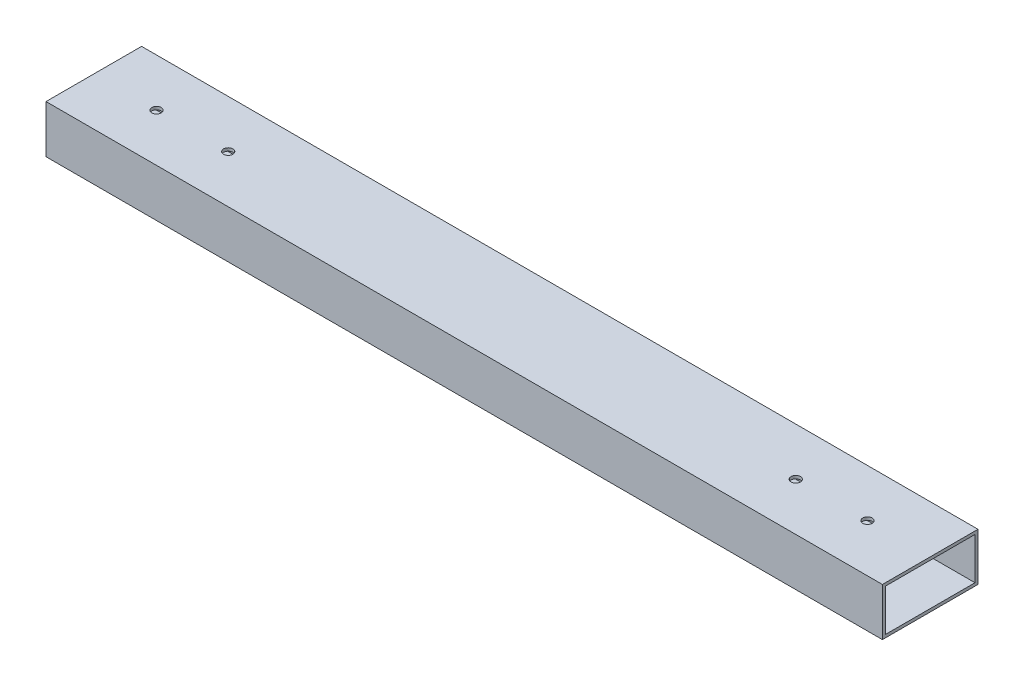
ISO-10303-21;
HEADER;
FILE_DESCRIPTION(('STEP AP214'),'2;1');
FILE_NAME('part.step','',(''),(''),'','','');
FILE_SCHEMA(('AUTOMOTIVE_DESIGN { 1 0 10303 214 1 1 1 1 }'));
ENDSEC;
DATA;
#1=APPLICATION_CONTEXT('core data for automotive mechanical design processes');
#2=APPLICATION_PROTOCOL_DEFINITION('international standard','automotive_design',2000,#1);
#3=PRODUCT_CONTEXT('',#1,'mechanical');
#4=PRODUCT('Part','Part','',(#3));
#5=PRODUCT_RELATED_PRODUCT_CATEGORY('part','',(#4));
#6=PRODUCT_DEFINITION_FORMATION('','',#4);
#7=PRODUCT_DEFINITION_CONTEXT('part definition',#1,'design');
#8=PRODUCT_DEFINITION('design','',#6,#7);
#9=PRODUCT_DEFINITION_SHAPE('','',#8);
#10=(LENGTH_UNIT() NAMED_UNIT(*) SI_UNIT(.MILLI.,.METRE.));
#11=(NAMED_UNIT(*) PLANE_ANGLE_UNIT() SI_UNIT($,.RADIAN.));
#12=(NAMED_UNIT(*) SI_UNIT($,.STERADIAN.) SOLID_ANGLE_UNIT());
#13=UNCERTAINTY_MEASURE_WITH_UNIT(LENGTH_MEASURE(1.E-05),#10,'distance_accuracy_value','');
#14=(GEOMETRIC_REPRESENTATION_CONTEXT(3) GLOBAL_UNCERTAINTY_ASSIGNED_CONTEXT((#13)) GLOBAL_UNIT_ASSIGNED_CONTEXT((#10,
#11,#12)) REPRESENTATION_CONTEXT('',''));
#15=CARTESIAN_POINT('',(0.,0.,0.));
#16=DIRECTION('',(0.,0.,1.));
#17=DIRECTION('',(1.,0.,0.));
#18=AXIS2_PLACEMENT_3D('',#15,#16,#17);
#19=CARTESIAN_POINT('',(222.25,0.,0.));
#20=DIRECTION('',(1.,0.,0.));
#21=DIRECTION('',(0.,0.,-1.));
#22=AXIS2_PLACEMENT_3D('',#19,#20,#21);
#23=PLANE('',#22);
#24=DIRECTION('',(0.,1.,0.));
#25=VECTOR('',#24,1.);
#26=CARTESIAN_POINT('',(222.25,101.6,-241.3));
#27=LINE('',#26,#25);
#28=CARTESIAN_POINT('',(222.25,101.6,-241.3));
#29=VERTEX_POINT('',#28);
#30=CARTESIAN_POINT('',(222.25,127.,-241.3));
#31=VERTEX_POINT('',#30);
#32=EDGE_CURVE('E115',#29,#31,#27,.T.);
#33=ORIENTED_EDGE('',*,*,#32,.T.);
#34=DIRECTION('',(0.,0.,1.));
#35=VECTOR('',#34,1.);
#36=CARTESIAN_POINT('',(222.25,127.,-241.3));
#37=LINE('',#36,#35);
#38=CARTESIAN_POINT('',(222.25,127.,-190.5));
#39=VERTEX_POINT('',#38);
#40=EDGE_CURVE('E163',#31,#39,#37,.T.);
#41=ORIENTED_EDGE('',*,*,#40,.T.);
#42=DIRECTION('',(0.,-1.,0.));
#43=VECTOR('',#42,1.);
#44=CARTESIAN_POINT('',(222.25,101.6,-190.5));
#45=LINE('',#44,#43);
#46=CARTESIAN_POINT('',(222.25,101.6,-190.5));
#47=VERTEX_POINT('',#46);
#48=EDGE_CURVE('E165',#39,#47,#45,.T.);
#49=ORIENTED_EDGE('',*,*,#48,.T.);
#50=DIRECTION('',(0.,0.,-1.));
#51=VECTOR('',#50,1.);
#52=CARTESIAN_POINT('',(222.25,101.6,-241.3));
#53=LINE('',#52,#51);
#54=EDGE_CURVE('E62',#47,#29,#53,.T.);
#55=ORIENTED_EDGE('',*,*,#54,.T.);
#56=EDGE_LOOP('',(#33,#41,#49,#55));
#57=FACE_BOUND('',#56,.T.);
#58=DIRECTION('',(0.,0.,1.));
#59=VECTOR('',#58,1.);
#60=CARTESIAN_POINT('',(222.25,125.4125,-239.7125));
#61=LINE('',#60,#59);
#62=CARTESIAN_POINT('',(222.25,125.4125,-239.7125));
#63=VERTEX_POINT('',#62);
#64=CARTESIAN_POINT('',(222.25,125.4125,-192.0875));
#65=VERTEX_POINT('',#64);
#66=EDGE_CURVE('E152',#63,#65,#61,.T.);
#67=ORIENTED_EDGE('',*,*,#66,.F.);
#68=DIRECTION('',(0.,1.,0.));
#69=VECTOR('',#68,1.);
#70=CARTESIAN_POINT('',(222.25,103.1875,-239.7125));
#71=LINE('',#70,#69);
#72=CARTESIAN_POINT('',(222.25,103.1875,-239.7125));
#73=VERTEX_POINT('',#72);
#74=EDGE_CURVE('E112',#73,#63,#71,.T.);
#75=ORIENTED_EDGE('',*,*,#74,.F.);
#76=DIRECTION('',(0.,0.,-1.));
#77=VECTOR('',#76,1.);
#78=CARTESIAN_POINT('',(222.25,103.1875,-239.7125));
#79=LINE('',#78,#77);
#80=CARTESIAN_POINT('',(222.25,103.1875,-192.0875));
#81=VERTEX_POINT('',#80);
#82=EDGE_CURVE('E156',#81,#73,#79,.T.);
#83=ORIENTED_EDGE('',*,*,#82,.F.);
#84=DIRECTION('',(0.,-1.,0.));
#85=VECTOR('',#84,1.);
#86=CARTESIAN_POINT('',(222.25,103.1875,-192.0875));
#87=LINE('',#86,#85);
#88=EDGE_CURVE('E154',#65,#81,#87,.T.);
#89=ORIENTED_EDGE('',*,*,#88,.F.);
#90=EDGE_LOOP('',(#67,#75,#83,#89));
#91=FACE_BOUND('',#90,.T.);
#92=ADVANCED_FACE('F37',(#57,#91),#23,.T.);
#93=CARTESIAN_POINT('',(222.25,101.6,-241.3));
#94=DIRECTION('',(0.,0.,1.));
#95=DIRECTION('',(1.,0.,0.));
#96=AXIS2_PLACEMENT_3D('',#93,#94,#95);
#97=PLANE('',#96);
#98=DIRECTION('',(-1.,0.,0.));
#99=VECTOR('',#98,1.);
#100=CARTESIAN_POINT('',(222.25,101.6,-241.3));
#101=LINE('',#100,#99);
#102=CARTESIAN_POINT('',(-222.25,101.6,-241.3));
#103=VERTEX_POINT('',#102);
#104=EDGE_CURVE('E168',#29,#103,#101,.T.);
#105=ORIENTED_EDGE('',*,*,#104,.T.);
#106=DIRECTION('',(0.,1.,0.));
#107=VECTOR('',#106,1.);
#108=CARTESIAN_POINT('',(-222.25,101.6,-241.3));
#109=LINE('',#108,#107);
#110=CARTESIAN_POINT('',(-222.25,127.,-241.3));
#111=VERTEX_POINT('',#110);
#112=EDGE_CURVE('E139',#103,#111,#109,.T.);
#113=ORIENTED_EDGE('',*,*,#112,.T.);
#114=DIRECTION('',(-1.,0.,0.));
#115=VECTOR('',#114,1.);
#116=CARTESIAN_POINT('',(222.25,127.,-241.3));
#117=LINE('',#116,#115);
#118=EDGE_CURVE('E11',#31,#111,#117,.T.);
#119=ORIENTED_EDGE('',*,*,#118,.F.);
#120=ORIENTED_EDGE('',*,*,#32,.F.);
#121=EDGE_LOOP('',(#105,#113,#119,#120));
#122=FACE_BOUND('',#121,.T.);
#123=ADVANCED_FACE('F39',(#122),#97,.F.);
#124=CARTESIAN_POINT('',(222.25,127.,-241.3));
#125=DIRECTION('',(0.,-1.,0.));
#126=DIRECTION('',(0.,0.,-1.));
#127=AXIS2_PLACEMENT_3D('',#124,#125,#126);
#128=PLANE('',#127);
#129=CARTESIAN_POINT('',(-150.8125,127.,-215.9));
#130=DIRECTION('',(0.,-1.,0.));
#131=DIRECTION('',(0.,0.,1.));
#132=AXIS2_PLACEMENT_3D('',#129,#130,#131);
#133=CIRCLE('',#132,2.48920000000001);
#134=CARTESIAN_POINT('',(-150.8125,127.,-213.4108));
#135=VERTEX_POINT('',#134);
#136=EDGE_CURVE('E184',#135,#135,#133,.T.);
#137=ORIENTED_EDGE('',*,*,#136,.T.);
#138=EDGE_LOOP('',(#137));
#139=FACE_BOUND('',#138,.T.);
#140=CARTESIAN_POINT('',(-188.9125,127.,-215.9));
#141=DIRECTION('',(0.,-1.,0.));
#142=DIRECTION('',(0.,0.,1.));
#143=AXIS2_PLACEMENT_3D('',#140,#141,#142);
#144=CIRCLE('',#143,2.48920000000001);
#145=CARTESIAN_POINT('',(-188.9125,127.,-213.4108));
#146=VERTEX_POINT('',#145);
#147=EDGE_CURVE('E191',#146,#146,#144,.T.);
#148=ORIENTED_EDGE('',*,*,#147,.T.);
#149=EDGE_LOOP('',(#148));
#150=FACE_BOUND('',#149,.T.);
#151=CARTESIAN_POINT('',(150.8125,127.,-215.9));
#152=DIRECTION('',(0.,1.,0.));
#153=DIRECTION('',(0.,0.,1.));
#154=AXIS2_PLACEMENT_3D('',#151,#152,#153);
#155=CIRCLE('',#154,2.48920000000001);
#156=CARTESIAN_POINT('',(150.8125,127.,-213.4108));
#157=VERTEX_POINT('',#156);
#158=EDGE_CURVE('E177',#157,#157,#155,.T.);
#159=ORIENTED_EDGE('',*,*,#158,.F.);
#160=EDGE_LOOP('',(#159));
#161=FACE_BOUND('',#160,.T.);
#162=CARTESIAN_POINT('',(188.9125,127.,-215.9));
#163=DIRECTION('',(0.,1.,0.));
#164=DIRECTION('',(0.,0.,1.));
#165=AXIS2_PLACEMENT_3D('',#162,#163,#164);
#166=CIRCLE('',#165,2.48920000000001);
#167=CARTESIAN_POINT('',(188.9125,127.,-213.4108));
#168=VERTEX_POINT('',#167);
#169=EDGE_CURVE('E206',#168,#168,#166,.T.);
#170=ORIENTED_EDGE('',*,*,#169,.F.);
#171=EDGE_LOOP('',(#170));
#172=FACE_BOUND('',#171,.T.);
#173=ORIENTED_EDGE('',*,*,#118,.T.);
#174=DIRECTION('',(0.,0.,1.));
#175=VECTOR('',#174,1.);
#176=CARTESIAN_POINT('',(-222.25,127.,-241.3));
#177=LINE('',#176,#175);
#178=CARTESIAN_POINT('',(-222.25,127.,-190.5));
#179=VERTEX_POINT('',#178);
#180=EDGE_CURVE('E142',#111,#179,#177,.T.);
#181=ORIENTED_EDGE('',*,*,#180,.T.);
#182=DIRECTION('',(-1.,0.,0.));
#183=VECTOR('',#182,1.);
#184=CARTESIAN_POINT('',(222.25,127.,-190.5));
#185=LINE('',#184,#183);
#186=EDGE_CURVE('E46',#39,#179,#185,.T.);
#187=ORIENTED_EDGE('',*,*,#186,.F.);
#188=ORIENTED_EDGE('',*,*,#40,.F.);
#189=EDGE_LOOP('',(#173,#181,#187,#188));
#190=FACE_BOUND('',#189,.T.);
#191=ADVANCED_FACE('F228',(#139,#150,#161,#172,#190),#128,.F.);
#192=CARTESIAN_POINT('',(222.25,101.6,-190.5));
#193=DIRECTION('',(0.,0.,-1.));
#194=DIRECTION('',(-1.,0.,0.));
#195=AXIS2_PLACEMENT_3D('',#192,#193,#194);
#196=PLANE('',#195);
#197=ORIENTED_EDGE('',*,*,#186,.T.);
#198=DIRECTION('',(0.,-1.,0.));
#199=VECTOR('',#198,1.);
#200=CARTESIAN_POINT('',(-222.25,101.6,-190.5));
#201=LINE('',#200,#199);
#202=CARTESIAN_POINT('',(-222.25,101.6,-190.5));
#203=VERTEX_POINT('',#202);
#204=EDGE_CURVE('E145',#179,#203,#201,.T.);
#205=ORIENTED_EDGE('',*,*,#204,.T.);
#206=DIRECTION('',(-1.,0.,0.));
#207=VECTOR('',#206,1.);
#208=CARTESIAN_POINT('',(222.25,101.6,-190.5));
#209=LINE('',#208,#207);
#210=EDGE_CURVE('E170',#47,#203,#209,.T.);
#211=ORIENTED_EDGE('',*,*,#210,.F.);
#212=ORIENTED_EDGE('',*,*,#48,.F.);
#213=EDGE_LOOP('',(#197,#205,#211,#212));
#214=FACE_BOUND('',#213,.T.);
#215=ADVANCED_FACE('F231',(#214),#196,.F.);
#216=CARTESIAN_POINT('',(222.25,101.6,-241.3));
#217=DIRECTION('',(0.,1.,0.));
#218=DIRECTION('',(0.,0.,1.));
#219=AXIS2_PLACEMENT_3D('',#216,#217,#218);
#220=PLANE('',#219);
#221=CARTESIAN_POINT('',(-150.8125,101.6,-215.9));
#222=DIRECTION('',(0.,1.,0.));
#223=DIRECTION('',(0.,0.,1.));
#224=AXIS2_PLACEMENT_3D('',#221,#222,#223);
#225=CIRCLE('',#224,2.48920000000001);
#226=CARTESIAN_POINT('',(-150.8125,101.6,-213.4108));
#227=VERTEX_POINT('',#226);
#228=EDGE_CURVE('E203',#227,#227,#225,.T.);
#229=ORIENTED_EDGE('',*,*,#228,.T.);
#230=EDGE_LOOP('',(#229));
#231=FACE_BOUND('',#230,.T.);
#232=CARTESIAN_POINT('',(-188.9125,101.6,-215.9));
#233=DIRECTION('',(0.,1.,0.));
#234=DIRECTION('',(0.,0.,1.));
#235=AXIS2_PLACEMENT_3D('',#232,#233,#234);
#236=CIRCLE('',#235,2.48920000000001);
#237=CARTESIAN_POINT('',(-188.9125,101.6,-213.4108));
#238=VERTEX_POINT('',#237);
#239=EDGE_CURVE('E188',#238,#238,#236,.T.);
#240=ORIENTED_EDGE('',*,*,#239,.T.);
#241=EDGE_LOOP('',(#240));
#242=FACE_BOUND('',#241,.T.);
#243=CARTESIAN_POINT('',(150.8125,101.6,-215.9));
#244=DIRECTION('',(0.,1.,0.));
#245=DIRECTION('',(0.,0.,1.));
#246=AXIS2_PLACEMENT_3D('',#243,#244,#245);
#247=CIRCLE('',#246,2.48920000000001);
#248=CARTESIAN_POINT('',(150.8125,101.6,-213.4108));
#249=VERTEX_POINT('',#248);
#250=EDGE_CURVE('E130',#249,#249,#247,.F.);
#251=ORIENTED_EDGE('',*,*,#250,.F.);
#252=EDGE_LOOP('',(#251));
#253=FACE_BOUND('',#252,.T.);
#254=CARTESIAN_POINT('',(188.9125,101.6,-215.9));
#255=DIRECTION('',(0.,1.,0.));
#256=DIRECTION('',(0.,0.,1.));
#257=AXIS2_PLACEMENT_3D('',#254,#255,#256);
#258=CIRCLE('',#257,2.48920000000001);
#259=CARTESIAN_POINT('',(188.9125,101.6,-213.4108));
#260=VERTEX_POINT('',#259);
#261=EDGE_CURVE('E180',#260,#260,#258,.F.);
#262=ORIENTED_EDGE('',*,*,#261,.F.);
#263=EDGE_LOOP('',(#262));
#264=FACE_BOUND('',#263,.T.);
#265=ORIENTED_EDGE('',*,*,#210,.T.);
#266=DIRECTION('',(0.,0.,-1.));
#267=VECTOR('',#266,1.);
#268=CARTESIAN_POINT('',(-222.25,101.6,-241.3));
#269=LINE('',#268,#267);
#270=EDGE_CURVE('E148',#203,#103,#269,.T.);
#271=ORIENTED_EDGE('',*,*,#270,.T.);
#272=ORIENTED_EDGE('',*,*,#104,.F.);
#273=ORIENTED_EDGE('',*,*,#54,.F.);
#274=EDGE_LOOP('',(#265,#271,#272,#273));
#275=FACE_BOUND('',#274,.T.);
#276=ADVANCED_FACE('F243',(#231,#242,#253,#264,#275),#220,.F.);
#277=CARTESIAN_POINT('',(222.25,103.1875,-239.7125));
#278=DIRECTION('',(0.,0.,1.));
#279=DIRECTION('',(1.,0.,0.));
#280=AXIS2_PLACEMENT_3D('',#277,#278,#279);
#281=PLANE('',#280);
#282=DIRECTION('',(-1.,0.,0.));
#283=VECTOR('',#282,1.);
#284=CARTESIAN_POINT('',(222.25,125.4125,-239.7125));
#285=LINE('',#284,#283);
#286=CARTESIAN_POINT('',(-222.25,125.4125,-239.7125));
#287=VERTEX_POINT('',#286);
#288=EDGE_CURVE('E104',#63,#287,#285,.T.);
#289=ORIENTED_EDGE('',*,*,#288,.T.);
#290=DIRECTION('',(0.,1.,0.));
#291=VECTOR('',#290,1.);
#292=CARTESIAN_POINT('',(-222.25,103.1875,-239.7125));
#293=LINE('',#292,#291);
#294=CARTESIAN_POINT('',(-222.25,103.1875,-239.7125));
#295=VERTEX_POINT('',#294);
#296=EDGE_CURVE('E109',#295,#287,#293,.T.);
#297=ORIENTED_EDGE('',*,*,#296,.F.);
#298=DIRECTION('',(-1.,0.,0.));
#299=VECTOR('',#298,1.);
#300=CARTESIAN_POINT('',(222.25,103.1875,-239.7125));
#301=LINE('',#300,#299);
#302=EDGE_CURVE('E158',#73,#295,#301,.T.);
#303=ORIENTED_EDGE('',*,*,#302,.F.);
#304=ORIENTED_EDGE('',*,*,#74,.T.);
#305=EDGE_LOOP('',(#289,#297,#303,#304));
#306=FACE_BOUND('',#305,.T.);
#307=ADVANCED_FACE('F106',(#306),#281,.T.);
#308=CARTESIAN_POINT('',(222.25,125.4125,-239.7125));
#309=DIRECTION('',(0.,-1.,0.));
#310=DIRECTION('',(0.,0.,-1.));
#311=AXIS2_PLACEMENT_3D('',#308,#309,#310);
#312=PLANE('',#311);
#313=CARTESIAN_POINT('',(-150.8125,125.4125,-215.9));
#314=DIRECTION('',(0.,-1.,0.));
#315=DIRECTION('',(0.,0.,-1.));
#316=AXIS2_PLACEMENT_3D('',#313,#314,#315);
#317=CIRCLE('',#316,2.48920000000001);
#318=CARTESIAN_POINT('',(-150.8125,125.4125,-218.3892));
#319=VERTEX_POINT('',#318);
#320=EDGE_CURVE('E200',#319,#319,#317,.T.);
#321=ORIENTED_EDGE('',*,*,#320,.F.);
#322=EDGE_LOOP('',(#321));
#323=FACE_BOUND('',#322,.T.);
#324=CARTESIAN_POINT('',(-188.9125,125.4125,-215.9));
#325=DIRECTION('',(0.,-1.,0.));
#326=DIRECTION('',(0.,0.,-1.));
#327=AXIS2_PLACEMENT_3D('',#324,#325,#326);
#328=CIRCLE('',#327,2.48920000000001);
#329=CARTESIAN_POINT('',(-188.9125,125.4125,-218.3892));
#330=VERTEX_POINT('',#329);
#331=EDGE_CURVE('E183',#330,#330,#328,.T.);
#332=ORIENTED_EDGE('',*,*,#331,.F.);
#333=EDGE_LOOP('',(#332));
#334=FACE_BOUND('',#333,.T.);
#335=CARTESIAN_POINT('',(150.8125,125.4125,-215.9));
#336=DIRECTION('',(0.,-1.,0.));
#337=DIRECTION('',(0.,0.,-1.));
#338=AXIS2_PLACEMENT_3D('',#335,#336,#337);
#339=CIRCLE('',#338,2.48920000000001);
#340=CARTESIAN_POINT('',(150.8125,125.4125,-218.3892));
#341=VERTEX_POINT('',#340);
#342=EDGE_CURVE('E133',#341,#341,#339,.F.);
#343=ORIENTED_EDGE('',*,*,#342,.T.);
#344=EDGE_LOOP('',(#343));
#345=FACE_BOUND('',#344,.T.);
#346=CARTESIAN_POINT('',(188.9125,125.4125,-215.9));
#347=DIRECTION('',(0.,-1.,0.));
#348=DIRECTION('',(0.,0.,-1.));
#349=AXIS2_PLACEMENT_3D('',#346,#347,#348);
#350=CIRCLE('',#349,2.48920000000001);
#351=CARTESIAN_POINT('',(188.9125,125.4125,-218.3892));
#352=VERTEX_POINT('',#351);
#353=EDGE_CURVE('E176',#352,#352,#350,.F.);
#354=ORIENTED_EDGE('',*,*,#353,.T.);
#355=EDGE_LOOP('',(#354));
#356=FACE_BOUND('',#355,.T.);
#357=DIRECTION('',(-1.,0.,0.));
#358=VECTOR('',#357,1.);
#359=CARTESIAN_POINT('',(222.25,125.4125,-192.0875));
#360=LINE('',#359,#358);
#361=CARTESIAN_POINT('',(-222.25,125.4125,-192.0875));
#362=VERTEX_POINT('',#361);
#363=EDGE_CURVE('E116',#65,#362,#360,.T.);
#364=ORIENTED_EDGE('',*,*,#363,.T.);
#365=DIRECTION('',(0.,0.,1.));
#366=VECTOR('',#365,1.);
#367=CARTESIAN_POINT('',(-222.25,125.4125,-239.7125));
#368=LINE('',#367,#366);
#369=EDGE_CURVE('E119',#287,#362,#368,.T.);
#370=ORIENTED_EDGE('',*,*,#369,.F.);
#371=ORIENTED_EDGE('',*,*,#288,.F.);
#372=ORIENTED_EDGE('',*,*,#66,.T.);
#373=EDGE_LOOP('',(#364,#370,#371,#372));
#374=FACE_BOUND('',#373,.T.);
#375=ADVANCED_FACE('F120',(#323,#334,#345,#356,#374),#312,.T.);
#376=CARTESIAN_POINT('',(222.25,103.1875,-192.0875));
#377=DIRECTION('',(0.,0.,-1.));
#378=DIRECTION('',(-1.,0.,0.));
#379=AXIS2_PLACEMENT_3D('',#376,#377,#378);
#380=PLANE('',#379);
#381=DIRECTION('',(-1.,0.,0.));
#382=VECTOR('',#381,1.);
#383=CARTESIAN_POINT('',(222.25,103.1875,-192.0875));
#384=LINE('',#383,#382);
#385=CARTESIAN_POINT('',(-222.25,103.1875,-192.0875));
#386=VERTEX_POINT('',#385);
#387=EDGE_CURVE('E54',#81,#386,#384,.T.);
#388=ORIENTED_EDGE('',*,*,#387,.T.);
#389=DIRECTION('',(0.,-1.,0.));
#390=VECTOR('',#389,1.);
#391=CARTESIAN_POINT('',(-222.25,103.1875,-192.0875));
#392=LINE('',#391,#390);
#393=EDGE_CURVE('E125',#362,#386,#392,.T.);
#394=ORIENTED_EDGE('',*,*,#393,.F.);
#395=ORIENTED_EDGE('',*,*,#363,.F.);
#396=ORIENTED_EDGE('',*,*,#88,.T.);
#397=EDGE_LOOP('',(#388,#394,#395,#396));
#398=FACE_BOUND('',#397,.T.);
#399=ADVANCED_FACE('F253',(#398),#380,.T.);
#400=CARTESIAN_POINT('',(222.25,103.1875,-239.7125));
#401=DIRECTION('',(0.,1.,0.));
#402=DIRECTION('',(0.,0.,1.));
#403=AXIS2_PLACEMENT_3D('',#400,#401,#402);
#404=PLANE('',#403);
#405=CARTESIAN_POINT('',(-150.8125,103.1875,-215.9));
#406=DIRECTION('',(0.,1.,0.));
#407=DIRECTION('',(0.,0.,1.));
#408=AXIS2_PLACEMENT_3D('',#405,#406,#407);
#409=CIRCLE('',#408,2.48920000000001);
#410=CARTESIAN_POINT('',(-150.8125,103.1875,-213.4108));
#411=VERTEX_POINT('',#410);
#412=EDGE_CURVE('E41',#411,#411,#409,.T.);
#413=ORIENTED_EDGE('',*,*,#412,.F.);
#414=EDGE_LOOP('',(#413));
#415=FACE_BOUND('',#414,.T.);
#416=CARTESIAN_POINT('',(-188.9125,103.1875,-215.9));
#417=DIRECTION('',(0.,1.,0.));
#418=DIRECTION('',(0.,0.,1.));
#419=AXIS2_PLACEMENT_3D('',#416,#417,#418);
#420=CIRCLE('',#419,2.48920000000001);
#421=CARTESIAN_POINT('',(-188.9125,103.1875,-213.4108));
#422=VERTEX_POINT('',#421);
#423=EDGE_CURVE('E181',#422,#422,#420,.T.);
#424=ORIENTED_EDGE('',*,*,#423,.F.);
#425=EDGE_LOOP('',(#424));
#426=FACE_BOUND('',#425,.T.);
#427=CARTESIAN_POINT('',(150.8125,103.1875,-215.9));
#428=DIRECTION('',(0.,1.,0.));
#429=DIRECTION('',(0.,0.,1.));
#430=AXIS2_PLACEMENT_3D('',#427,#428,#429);
#431=CIRCLE('',#430,2.48920000000001);
#432=CARTESIAN_POINT('',(150.8125,103.1875,-213.4108));
#433=VERTEX_POINT('',#432);
#434=EDGE_CURVE('E178',#433,#433,#431,.F.);
#435=ORIENTED_EDGE('',*,*,#434,.T.);
#436=EDGE_LOOP('',(#435));
#437=FACE_BOUND('',#436,.T.);
#438=CARTESIAN_POINT('',(188.9125,103.1875,-215.9));
#439=DIRECTION('',(0.,1.,0.));
#440=DIRECTION('',(0.,0.,1.));
#441=AXIS2_PLACEMENT_3D('',#438,#439,#440);
#442=CIRCLE('',#441,2.48920000000001);
#443=CARTESIAN_POINT('',(188.9125,103.1875,-213.4108));
#444=VERTEX_POINT('',#443);
#445=EDGE_CURVE('E173',#444,#444,#442,.F.);
#446=ORIENTED_EDGE('',*,*,#445,.T.);
#447=EDGE_LOOP('',(#446));
#448=FACE_BOUND('',#447,.T.);
#449=ORIENTED_EDGE('',*,*,#302,.T.);
#450=DIRECTION('',(0.,0.,-1.));
#451=VECTOR('',#450,1.);
#452=CARTESIAN_POINT('',(-222.25,103.1875,-239.7125));
#453=LINE('',#452,#451);
#454=EDGE_CURVE('E129',#386,#295,#453,.T.);
#455=ORIENTED_EDGE('',*,*,#454,.F.);
#456=ORIENTED_EDGE('',*,*,#387,.F.);
#457=ORIENTED_EDGE('',*,*,#82,.T.);
#458=EDGE_LOOP('',(#449,#455,#456,#457));
#459=FACE_BOUND('',#458,.T.);
#460=ADVANCED_FACE('F254',(#415,#426,#437,#448,#459),#404,.T.);
#461=CARTESIAN_POINT('',(-222.25,0.,0.));
#462=DIRECTION('',(1.,0.,0.));
#463=DIRECTION('',(0.,0.,-1.));
#464=AXIS2_PLACEMENT_3D('',#461,#462,#463);
#465=PLANE('',#464);
#466=ORIENTED_EDGE('',*,*,#454,.T.);
#467=ORIENTED_EDGE('',*,*,#296,.T.);
#468=ORIENTED_EDGE('',*,*,#369,.T.);
#469=ORIENTED_EDGE('',*,*,#393,.T.);
#470=EDGE_LOOP('',(#466,#467,#468,#469));
#471=FACE_BOUND('',#470,.T.);
#472=ORIENTED_EDGE('',*,*,#112,.F.);
#473=ORIENTED_EDGE('',*,*,#270,.F.);
#474=ORIENTED_EDGE('',*,*,#204,.F.);
#475=ORIENTED_EDGE('',*,*,#180,.F.);
#476=EDGE_LOOP('',(#472,#473,#474,#475));
#477=FACE_BOUND('',#476,.T.);
#478=ADVANCED_FACE('F127',(#471,#477),#465,.F.);
#479=CARTESIAN_POINT('',(188.9125,127.,-215.9));
#480=DIRECTION('',(0.,-1.,0.));
#481=DIRECTION('',(0.,0.,-1.));
#482=AXIS2_PLACEMENT_3D('',#479,#480,#481);
#483=CYLINDRICAL_SURFACE('',#482,2.48920000000001);
#484=ORIENTED_EDGE('',*,*,#445,.F.);
#485=EDGE_LOOP('',(#484));
#486=FACE_BOUND('',#485,.T.);
#487=ORIENTED_EDGE('',*,*,#261,.T.);
#488=EDGE_LOOP('',(#487));
#489=FACE_BOUND('',#488,.T.);
#490=ADVANCED_FACE('F262',(#486,#489),#483,.F.);
#491=CARTESIAN_POINT('',(150.8125,127.,-215.9));
#492=DIRECTION('',(0.,-1.,0.));
#493=DIRECTION('',(0.,0.,-1.));
#494=AXIS2_PLACEMENT_3D('',#491,#492,#493);
#495=CYLINDRICAL_SURFACE('',#494,2.48920000000001);
#496=ORIENTED_EDGE('',*,*,#434,.F.);
#497=EDGE_LOOP('',(#496));
#498=FACE_BOUND('',#497,.T.);
#499=ORIENTED_EDGE('',*,*,#250,.T.);
#500=EDGE_LOOP('',(#499));
#501=FACE_BOUND('',#500,.T.);
#502=ADVANCED_FACE('F225',(#498,#501),#495,.F.);
#503=ORIENTED_EDGE('',*,*,#353,.F.);
#504=EDGE_LOOP('',(#503));
#505=FACE_BOUND('',#504,.T.);
#506=ORIENTED_EDGE('',*,*,#169,.T.);
#507=EDGE_LOOP('',(#506));
#508=FACE_BOUND('',#507,.T.);
#509=ADVANCED_FACE('F223',(#505,#508),#483,.F.);
#510=ORIENTED_EDGE('',*,*,#342,.F.);
#511=EDGE_LOOP('',(#510));
#512=FACE_BOUND('',#511,.T.);
#513=ORIENTED_EDGE('',*,*,#158,.T.);
#514=EDGE_LOOP('',(#513));
#515=FACE_BOUND('',#514,.T.);
#516=ADVANCED_FACE('F219',(#512,#515),#495,.F.);
#517=CARTESIAN_POINT('',(-188.9125,127.,-215.9));
#518=DIRECTION('',(0.,-1.,0.));
#519=DIRECTION('',(0.,0.,-1.));
#520=AXIS2_PLACEMENT_3D('',#517,#518,#519);
#521=CYLINDRICAL_SURFACE('',#520,2.48920000000001);
#522=ORIENTED_EDGE('',*,*,#423,.T.);
#523=EDGE_LOOP('',(#522));
#524=FACE_BOUND('',#523,.T.);
#525=ORIENTED_EDGE('',*,*,#239,.F.);
#526=EDGE_LOOP('',(#525));
#527=FACE_BOUND('',#526,.T.);
#528=ADVANCED_FACE('F222',(#524,#527),#521,.F.);
#529=CARTESIAN_POINT('',(-150.8125,127.,-215.9));
#530=DIRECTION('',(0.,-1.,0.));
#531=DIRECTION('',(0.,0.,-1.));
#532=AXIS2_PLACEMENT_3D('',#529,#530,#531);
#533=CYLINDRICAL_SURFACE('',#532,2.48920000000001);
#534=ORIENTED_EDGE('',*,*,#412,.T.);
#535=EDGE_LOOP('',(#534));
#536=FACE_BOUND('',#535,.T.);
#537=ORIENTED_EDGE('',*,*,#228,.F.);
#538=EDGE_LOOP('',(#537));
#539=FACE_BOUND('',#538,.T.);
#540=ADVANCED_FACE('F369',(#536,#539),#533,.F.);
#541=ORIENTED_EDGE('',*,*,#331,.T.);
#542=EDGE_LOOP('',(#541));
#543=FACE_BOUND('',#542,.T.);
#544=ORIENTED_EDGE('',*,*,#147,.F.);
#545=EDGE_LOOP('',(#544));
#546=FACE_BOUND('',#545,.T.);
#547=ADVANCED_FACE('F371',(#543,#546),#521,.F.);
#548=ORIENTED_EDGE('',*,*,#320,.T.);
#549=EDGE_LOOP('',(#548));
#550=FACE_BOUND('',#549,.T.);
#551=ORIENTED_EDGE('',*,*,#136,.F.);
#552=EDGE_LOOP('',(#551));
#553=FACE_BOUND('',#552,.T.);
#554=ADVANCED_FACE('F378',(#550,#553),#533,.F.);
#555=CLOSED_SHELL('',(#92,#123,#191,#215,#276,#307,#375,#399,#460,#478,#490,#502,#509,#516,#528,
#540,#547,#554));
#556=MANIFOLD_SOLID_BREP('B2',#555);
#557=ADVANCED_BREP_SHAPE_REPRESENTATION('',(#18,#556),#14);
#558=SHAPE_DEFINITION_REPRESENTATION(#9,#557);
ENDSEC;
END-ISO-10303-21;
